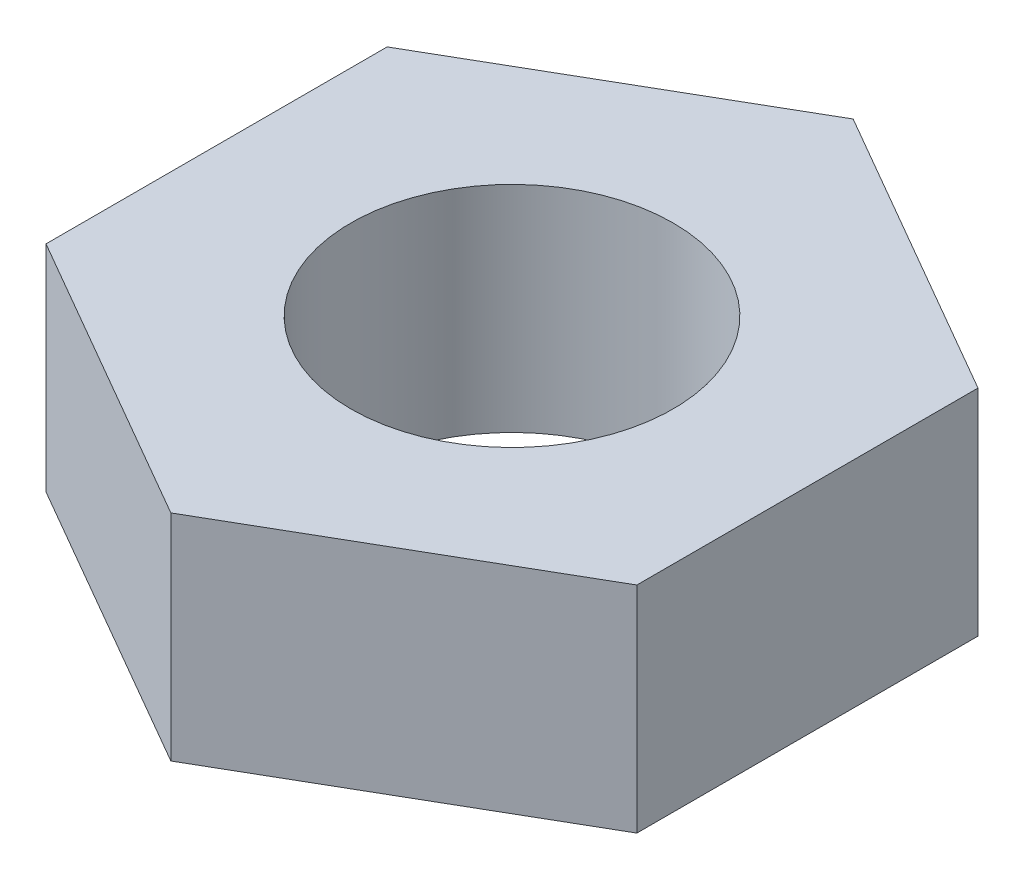
ISO-10303-21;
HEADER;
FILE_DESCRIPTION(('STEP AP214'),'2;1');
FILE_NAME('part.step','',(''),(''),'','','');
FILE_SCHEMA(('AUTOMOTIVE_DESIGN { 1 0 10303 214 1 1 1 1 }'));
ENDSEC;
DATA;
#1=APPLICATION_CONTEXT('core data for automotive mechanical design processes');
#2=APPLICATION_PROTOCOL_DEFINITION('international standard','automotive_design',2000,#1);
#3=PRODUCT_CONTEXT('',#1,'mechanical');
#4=PRODUCT('Part','Part','',(#3));
#5=PRODUCT_RELATED_PRODUCT_CATEGORY('part','',(#4));
#6=PRODUCT_DEFINITION_FORMATION('','',#4);
#7=PRODUCT_DEFINITION_CONTEXT('part definition',#1,'design');
#8=PRODUCT_DEFINITION('design','',#6,#7);
#9=PRODUCT_DEFINITION_SHAPE('','',#8);
#10=(LENGTH_UNIT() NAMED_UNIT(*) SI_UNIT(.MILLI.,.METRE.));
#11=(NAMED_UNIT(*) PLANE_ANGLE_UNIT() SI_UNIT($,.RADIAN.));
#12=(NAMED_UNIT(*) SI_UNIT($,.STERADIAN.) SOLID_ANGLE_UNIT());
#13=UNCERTAINTY_MEASURE_WITH_UNIT(LENGTH_MEASURE(1.E-05),#10,'distance_accuracy_value','');
#14=(GEOMETRIC_REPRESENTATION_CONTEXT(3) GLOBAL_UNCERTAINTY_ASSIGNED_CONTEXT((#13)) GLOBAL_UNIT_ASSIGNED_CONTEXT((#10,
#11,#12)) REPRESENTATION_CONTEXT('',''));
#15=CARTESIAN_POINT('',(0.,0.,0.));
#16=DIRECTION('',(0.,0.,1.));
#17=DIRECTION('',(1.,0.,0.));
#18=AXIS2_PLACEMENT_3D('',#15,#16,#17);
#19=CARTESIAN_POINT('',(0.,2.,0.));
#20=DIRECTION('',(0.,1.,0.));
#21=DIRECTION('',(0.,0.,1.));
#22=AXIS2_PLACEMENT_3D('',#19,#20,#21);
#23=PLANE('',#22);
#24=DIRECTION('',(-0.866025403784439,0.,-0.5));
#25=VECTOR('',#24,1.);
#26=CARTESIAN_POINT('',(2.75,2.,-1.58771324027147));
#27=LINE('',#26,#25);
#28=CARTESIAN_POINT('',(2.75,2.,-1.58771324027147));
#29=VERTEX_POINT('',#28);
#30=CARTESIAN_POINT('',(0.,2.,-3.17542648054294));
#31=VERTEX_POINT('',#30);
#32=EDGE_CURVE('E131',#29,#31,#27,.T.);
#33=ORIENTED_EDGE('',*,*,#32,.T.);
#34=DIRECTION('',(-0.866025403784439,0.,0.5));
#35=VECTOR('',#34,1.);
#36=CARTESIAN_POINT('',(0.,2.,-3.17542648054294));
#37=LINE('',#36,#35);
#38=CARTESIAN_POINT('',(-2.75,2.,-1.58771324027147));
#39=VERTEX_POINT('',#38);
#40=EDGE_CURVE('E89',#31,#39,#37,.T.);
#41=ORIENTED_EDGE('',*,*,#40,.T.);
#42=DIRECTION('',(0.,0.,1.));
#43=VECTOR('',#42,1.);
#44=CARTESIAN_POINT('',(-2.75,2.,-1.58771324027147));
#45=LINE('',#44,#43);
#46=CARTESIAN_POINT('',(-2.75,2.,1.58771324027147));
#47=VERTEX_POINT('',#46);
#48=EDGE_CURVE('E102',#39,#47,#45,.T.);
#49=ORIENTED_EDGE('',*,*,#48,.T.);
#50=DIRECTION('',(0.866025403784439,0.,0.5));
#51=VECTOR('',#50,1.);
#52=CARTESIAN_POINT('',(-2.75,2.,1.58771324027147));
#53=LINE('',#52,#51);
#54=CARTESIAN_POINT('',(0.,2.,3.17542648054294));
#55=VERTEX_POINT('',#54);
#56=EDGE_CURVE('E96',#47,#55,#53,.T.);
#57=ORIENTED_EDGE('',*,*,#56,.T.);
#58=DIRECTION('',(0.866025403784439,0.,-0.5));
#59=VECTOR('',#58,1.);
#60=CARTESIAN_POINT('',(0.,2.,3.17542648054294));
#61=LINE('',#60,#59);
#62=CARTESIAN_POINT('',(2.75,2.,1.58771324027147));
#63=VERTEX_POINT('',#62);
#64=EDGE_CURVE('E100',#55,#63,#61,.T.);
#65=ORIENTED_EDGE('',*,*,#64,.T.);
#66=DIRECTION('',(0.,0.,-1.));
#67=VECTOR('',#66,1.);
#68=CARTESIAN_POINT('',(2.75,2.,1.58771324027147));
#69=LINE('',#68,#67);
#70=EDGE_CURVE('E52',#63,#29,#69,.T.);
#71=ORIENTED_EDGE('',*,*,#70,.T.);
#72=EDGE_LOOP('',(#33,#41,#49,#57,#65,#71));
#73=FACE_BOUND('',#72,.T.);
#74=CARTESIAN_POINT('',(0.,2.,0.));
#75=DIRECTION('',(0.,1.,0.));
#76=DIRECTION('',(0.,0.,1.));
#77=AXIS2_PLACEMENT_3D('',#74,#75,#76);
#78=CIRCLE('',#77,1.5);
#79=CARTESIAN_POINT('',(0.,2.,1.5));
#80=VERTEX_POINT('',#79);
#81=EDGE_CURVE('E124',#80,#80,#78,.T.);
#82=ORIENTED_EDGE('',*,*,#81,.F.);
#83=EDGE_LOOP('',(#82));
#84=FACE_BOUND('',#83,.T.);
#85=ADVANCED_FACE('F35',(#73,#84),#23,.T.);
#86=CARTESIAN_POINT('',(0.,0.,0.));
#87=DIRECTION('',(0.,1.,0.));
#88=DIRECTION('',(0.,0.,1.));
#89=AXIS2_PLACEMENT_3D('',#86,#87,#88);
#90=PLANE('',#89);
#91=DIRECTION('',(-0.866025403784439,0.,-0.5));
#92=VECTOR('',#91,1.);
#93=CARTESIAN_POINT('',(2.75,0.,-1.58771324027147));
#94=LINE('',#93,#92);
#95=CARTESIAN_POINT('',(2.75,0.,-1.58771324027147));
#96=VERTEX_POINT('',#95);
#97=CARTESIAN_POINT('',(0.,0.,-3.17542648054294));
#98=VERTEX_POINT('',#97);
#99=EDGE_CURVE('E120',#96,#98,#94,.T.);
#100=ORIENTED_EDGE('',*,*,#99,.F.);
#101=DIRECTION('',(0.,0.,-1.));
#102=VECTOR('',#101,1.);
#103=CARTESIAN_POINT('',(2.75,0.,1.58771324027147));
#104=LINE('',#103,#102);
#105=CARTESIAN_POINT('',(2.75,0.,1.58771324027147));
#106=VERTEX_POINT('',#105);
#107=EDGE_CURVE('E81',#106,#96,#104,.T.);
#108=ORIENTED_EDGE('',*,*,#107,.F.);
#109=DIRECTION('',(0.866025403784439,0.,-0.5));
#110=VECTOR('',#109,1.);
#111=CARTESIAN_POINT('',(0.,0.,3.17542648054294));
#112=LINE('',#111,#110);
#113=CARTESIAN_POINT('',(0.,0.,3.17542648054294));
#114=VERTEX_POINT('',#113);
#115=EDGE_CURVE('E75',#114,#106,#112,.T.);
#116=ORIENTED_EDGE('',*,*,#115,.F.);
#117=DIRECTION('',(0.866025403784439,0.,0.5));
#118=VECTOR('',#117,1.);
#119=CARTESIAN_POINT('',(-2.75,0.,1.58771324027147));
#120=LINE('',#119,#118);
#121=CARTESIAN_POINT('',(-2.75,0.,1.58771324027147));
#122=VERTEX_POINT('',#121);
#123=EDGE_CURVE('E110',#122,#114,#120,.T.);
#124=ORIENTED_EDGE('',*,*,#123,.F.);
#125=DIRECTION('',(0.,0.,1.));
#126=VECTOR('',#125,1.);
#127=CARTESIAN_POINT('',(-2.75,0.,-1.58771324027147));
#128=LINE('',#127,#126);
#129=CARTESIAN_POINT('',(-2.75,0.,-1.58771324027147));
#130=VERTEX_POINT('',#129);
#131=EDGE_CURVE('E126',#130,#122,#128,.T.);
#132=ORIENTED_EDGE('',*,*,#131,.F.);
#133=DIRECTION('',(-0.866025403784439,0.,0.5));
#134=VECTOR('',#133,1.);
#135=CARTESIAN_POINT('',(0.,0.,-3.17542648054294));
#136=LINE('',#135,#134);
#137=EDGE_CURVE('E123',#98,#130,#136,.T.);
#138=ORIENTED_EDGE('',*,*,#137,.F.);
#139=EDGE_LOOP('',(#100,#108,#116,#124,#132,#138));
#140=FACE_BOUND('',#139,.T.);
#141=CARTESIAN_POINT('',(0.,0.,0.));
#142=DIRECTION('',(0.,1.,0.));
#143=DIRECTION('',(0.,0.,1.));
#144=AXIS2_PLACEMENT_3D('',#141,#142,#143);
#145=CIRCLE('',#144,1.5);
#146=CARTESIAN_POINT('',(0.,0.,1.5));
#147=VERTEX_POINT('',#146);
#148=EDGE_CURVE('E224',#147,#147,#145,.T.);
#149=ORIENTED_EDGE('',*,*,#148,.T.);
#150=EDGE_LOOP('',(#149));
#151=FACE_BOUND('',#150,.T.);
#152=ADVANCED_FACE('F140',(#140,#151),#90,.F.);
#153=CARTESIAN_POINT('',(2.75,2.,-1.58771324027147));
#154=DIRECTION('',(-0.5,0.,0.866025403784439));
#155=DIRECTION('',(0.866025403784439,0.,0.5));
#156=AXIS2_PLACEMENT_3D('',#153,#154,#155);
#157=PLANE('',#156);
#158=ORIENTED_EDGE('',*,*,#99,.T.);
#159=DIRECTION('',(0.,-1.,0.));
#160=VECTOR('',#159,1.);
#161=CARTESIAN_POINT('',(0.,2.,-3.17542648054294));
#162=LINE('',#161,#160);
#163=EDGE_CURVE('E11',#31,#98,#162,.T.);
#164=ORIENTED_EDGE('',*,*,#163,.F.);
#165=ORIENTED_EDGE('',*,*,#32,.F.);
#166=DIRECTION('',(0.,-1.,0.));
#167=VECTOR('',#166,1.);
#168=CARTESIAN_POINT('',(2.75,2.,-1.58771324027147));
#169=LINE('',#168,#167);
#170=EDGE_CURVE('E116',#29,#96,#169,.T.);
#171=ORIENTED_EDGE('',*,*,#170,.T.);
#172=EDGE_LOOP('',(#158,#164,#165,#171));
#173=FACE_BOUND('',#172,.T.);
#174=ADVANCED_FACE('F37',(#173),#157,.F.);
#175=CARTESIAN_POINT('',(0.,2.,-3.17542648054294));
#176=DIRECTION('',(0.5,0.,0.866025403784439));
#177=DIRECTION('',(0.866025403784439,0.,-0.5));
#178=AXIS2_PLACEMENT_3D('',#175,#176,#177);
#179=PLANE('',#178);
#180=ORIENTED_EDGE('',*,*,#137,.T.);
#181=DIRECTION('',(0.,-1.,0.));
#182=VECTOR('',#181,1.);
#183=CARTESIAN_POINT('',(-2.75,2.,-1.58771324027147));
#184=LINE('',#183,#182);
#185=EDGE_CURVE('E44',#39,#130,#184,.T.);
#186=ORIENTED_EDGE('',*,*,#185,.F.);
#187=ORIENTED_EDGE('',*,*,#40,.F.);
#188=ORIENTED_EDGE('',*,*,#163,.T.);
#189=EDGE_LOOP('',(#180,#186,#187,#188));
#190=FACE_BOUND('',#189,.T.);
#191=ADVANCED_FACE('F165',(#190),#179,.F.);
#192=CARTESIAN_POINT('',(-2.75,2.,-1.58771324027147));
#193=DIRECTION('',(1.,0.,0.));
#194=DIRECTION('',(0.,0.,-1.));
#195=AXIS2_PLACEMENT_3D('',#192,#193,#194);
#196=PLANE('',#195);
#197=ORIENTED_EDGE('',*,*,#131,.T.);
#198=DIRECTION('',(0.,-1.,0.));
#199=VECTOR('',#198,1.);
#200=CARTESIAN_POINT('',(-2.75,2.,1.58771324027147));
#201=LINE('',#200,#199);
#202=EDGE_CURVE('E111',#47,#122,#201,.T.);
#203=ORIENTED_EDGE('',*,*,#202,.F.);
#204=ORIENTED_EDGE('',*,*,#48,.F.);
#205=ORIENTED_EDGE('',*,*,#185,.T.);
#206=EDGE_LOOP('',(#197,#203,#204,#205));
#207=FACE_BOUND('',#206,.T.);
#208=ADVANCED_FACE('F137',(#207),#196,.F.);
#209=CARTESIAN_POINT('',(-2.75,2.,1.58771324027147));
#210=DIRECTION('',(0.5,0.,-0.866025403784439));
#211=DIRECTION('',(-0.866025403784439,0.,-0.5));
#212=AXIS2_PLACEMENT_3D('',#209,#210,#211);
#213=PLANE('',#212);
#214=ORIENTED_EDGE('',*,*,#123,.T.);
#215=DIRECTION('',(0.,-1.,0.));
#216=VECTOR('',#215,1.);
#217=CARTESIAN_POINT('',(0.,2.,3.17542648054294));
#218=LINE('',#217,#216);
#219=EDGE_CURVE('E107',#55,#114,#218,.T.);
#220=ORIENTED_EDGE('',*,*,#219,.F.);
#221=ORIENTED_EDGE('',*,*,#56,.F.);
#222=ORIENTED_EDGE('',*,*,#202,.T.);
#223=EDGE_LOOP('',(#214,#220,#221,#222));
#224=FACE_BOUND('',#223,.T.);
#225=ADVANCED_FACE('F108',(#224),#213,.F.);
#226=CARTESIAN_POINT('',(0.,2.,3.17542648054294));
#227=DIRECTION('',(-0.5,0.,-0.866025403784439));
#228=DIRECTION('',(-0.866025403784439,0.,0.5));
#229=AXIS2_PLACEMENT_3D('',#226,#227,#228);
#230=PLANE('',#229);
#231=ORIENTED_EDGE('',*,*,#115,.T.);
#232=DIRECTION('',(0.,-1.,0.));
#233=VECTOR('',#232,1.);
#234=CARTESIAN_POINT('',(2.75,2.,1.58771324027147));
#235=LINE('',#234,#233);
#236=EDGE_CURVE('E112',#63,#106,#235,.T.);
#237=ORIENTED_EDGE('',*,*,#236,.F.);
#238=ORIENTED_EDGE('',*,*,#64,.F.);
#239=ORIENTED_EDGE('',*,*,#219,.T.);
#240=EDGE_LOOP('',(#231,#237,#238,#239));
#241=FACE_BOUND('',#240,.T.);
#242=ADVANCED_FACE('F114',(#241),#230,.F.);
#243=CARTESIAN_POINT('',(2.75,2.,1.58771324027147));
#244=DIRECTION('',(-1.,0.,0.));
#245=DIRECTION('',(0.,0.,1.));
#246=AXIS2_PLACEMENT_3D('',#243,#244,#245);
#247=PLANE('',#246);
#248=ORIENTED_EDGE('',*,*,#107,.T.);
#249=ORIENTED_EDGE('',*,*,#170,.F.);
#250=ORIENTED_EDGE('',*,*,#70,.F.);
#251=ORIENTED_EDGE('',*,*,#236,.T.);
#252=EDGE_LOOP('',(#248,#249,#250,#251));
#253=FACE_BOUND('',#252,.T.);
#254=ADVANCED_FACE('F145',(#253),#247,.F.);
#255=CARTESIAN_POINT('',(0.,2.,0.));
#256=DIRECTION('',(0.,-1.,0.));
#257=DIRECTION('',(0.,0.,-1.));
#258=AXIS2_PLACEMENT_3D('',#255,#256,#257);
#259=CYLINDRICAL_SURFACE('',#258,1.5);
#260=ORIENTED_EDGE('',*,*,#81,.T.);
#261=EDGE_LOOP('',(#260));
#262=FACE_BOUND('',#261,.T.);
#263=ORIENTED_EDGE('',*,*,#148,.F.);
#264=EDGE_LOOP('',(#263));
#265=FACE_BOUND('',#264,.T.);
#266=ADVANCED_FACE('F147',(#262,#265),#259,.F.);
#267=CLOSED_SHELL('',(#85,#152,#174,#191,#208,#225,#242,#254,#266));
#268=MANIFOLD_SOLID_BREP('B2',#267);
#269=ADVANCED_BREP_SHAPE_REPRESENTATION('',(#18,#268),#14);
#270=SHAPE_DEFINITION_REPRESENTATION(#9,#269);
ENDSEC;
END-ISO-10303-21;
